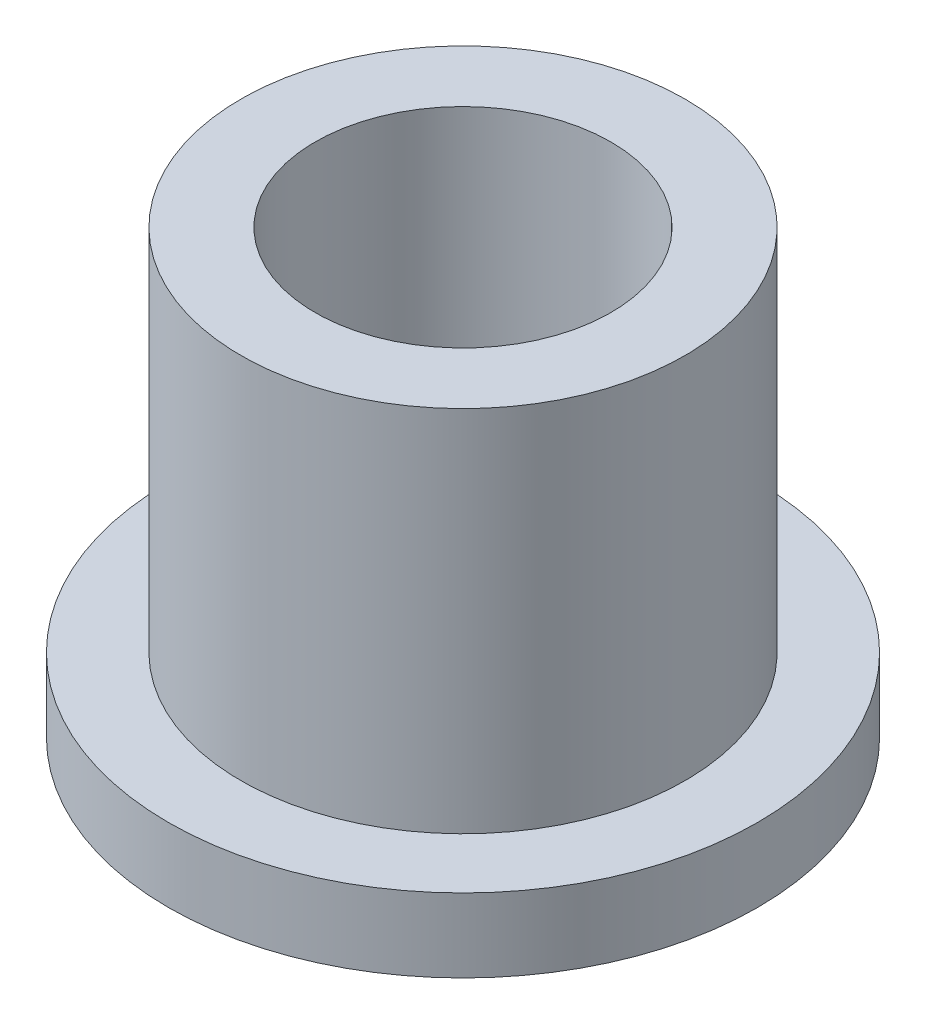
ISO-10303-21;
HEADER;
FILE_DESCRIPTION(('STEP AP214'),'2;1');
FILE_NAME('part.step','',(''),(''),'','','');
FILE_SCHEMA(('AUTOMOTIVE_DESIGN { 1 0 10303 214 1 1 1 1 }'));
ENDSEC;
DATA;
#1=APPLICATION_CONTEXT('core data for automotive mechanical design processes');
#2=APPLICATION_PROTOCOL_DEFINITION('international standard','automotive_design',2000,#1);
#3=PRODUCT_CONTEXT('',#1,'mechanical');
#4=PRODUCT('Part','Part','',(#3));
#5=PRODUCT_RELATED_PRODUCT_CATEGORY('part','',(#4));
#6=PRODUCT_DEFINITION_FORMATION('','',#4);
#7=PRODUCT_DEFINITION_CONTEXT('part definition',#1,'design');
#8=PRODUCT_DEFINITION('design','',#6,#7);
#9=PRODUCT_DEFINITION_SHAPE('','',#8);
#10=(LENGTH_UNIT() NAMED_UNIT(*) SI_UNIT(.MILLI.,.METRE.));
#11=(NAMED_UNIT(*) PLANE_ANGLE_UNIT() SI_UNIT($,.RADIAN.));
#12=(NAMED_UNIT(*) SI_UNIT($,.STERADIAN.) SOLID_ANGLE_UNIT());
#13=UNCERTAINTY_MEASURE_WITH_UNIT(LENGTH_MEASURE(1.E-05),#10,'distance_accuracy_value','');
#14=(GEOMETRIC_REPRESENTATION_CONTEXT(3) GLOBAL_UNCERTAINTY_ASSIGNED_CONTEXT((#13)) GLOBAL_UNIT_ASSIGNED_CONTEXT((#10,
#11,#12)) REPRESENTATION_CONTEXT('',''));
#15=CARTESIAN_POINT('',(0.,0.,0.));
#16=DIRECTION('',(0.,0.,1.));
#17=DIRECTION('',(1.,0.,0.));
#18=AXIS2_PLACEMENT_3D('',#15,#16,#17);
#19=CARTESIAN_POINT('',(0.,9.525,0.));
#20=DIRECTION('',(0.,1.,0.));
#21=DIRECTION('',(0.,0.,1.));
#22=AXIS2_PLACEMENT_3D('',#19,#20,#21);
#23=PLANE('',#22);
#24=CARTESIAN_POINT('',(0.,9.525,0.));
#25=DIRECTION('',(0.,1.,0.));
#26=DIRECTION('',(0.,0.,1.));
#27=AXIS2_PLACEMENT_3D('',#24,#25,#26);
#28=CIRCLE('',#27,4.7879);
#29=CARTESIAN_POINT('',(0.,9.525,-4.7879));
#30=VERTEX_POINT('',#29);
#31=EDGE_CURVE('E10',#30,#30,#28,.T.);
#32=ORIENTED_EDGE('',*,*,#31,.T.);
#33=EDGE_LOOP('',(#32));
#34=FACE_BOUND('',#33,.T.);
#35=CARTESIAN_POINT('',(0.,9.525,0.));
#36=DIRECTION('',(0.,1.,0.));
#37=DIRECTION('',(0.,0.,1.));
#38=AXIS2_PLACEMENT_3D('',#35,#36,#37);
#39=CIRCLE('',#38,3.1877);
#40=CARTESIAN_POINT('',(0.,9.525,-3.1877));
#41=VERTEX_POINT('',#40);
#42=EDGE_CURVE('E37',#41,#41,#39,.T.);
#43=ORIENTED_EDGE('',*,*,#42,.F.);
#44=EDGE_LOOP('',(#43));
#45=FACE_BOUND('',#44,.T.);
#46=ADVANCED_FACE('F30',(#34,#45),#23,.T.);
#47=CARTESIAN_POINT('',(0.,0.,0.));
#48=DIRECTION('',(0.,1.,0.));
#49=DIRECTION('',(0.,0.,1.));
#50=AXIS2_PLACEMENT_3D('',#47,#48,#49);
#51=PLANE('',#50);
#52=CARTESIAN_POINT('',(0.,0.,0.));
#53=DIRECTION('',(0.,1.,0.));
#54=DIRECTION('',(0.,0.,1.));
#55=AXIS2_PLACEMENT_3D('',#52,#53,#54);
#56=CIRCLE('',#55,3.1877);
#57=CARTESIAN_POINT('',(0.,0.,-3.1877));
#58=VERTEX_POINT('',#57);
#59=EDGE_CURVE('E41',#58,#58,#56,.T.);
#60=ORIENTED_EDGE('',*,*,#59,.T.);
#61=EDGE_LOOP('',(#60));
#62=FACE_BOUND('',#61,.T.);
#63=CARTESIAN_POINT('',(0.,0.,0.));
#64=DIRECTION('',(0.,1.,0.));
#65=DIRECTION('',(0.,0.,1.));
#66=AXIS2_PLACEMENT_3D('',#63,#64,#65);
#67=CIRCLE('',#66,6.35);
#68=CARTESIAN_POINT('',(0.,0.,6.35));
#69=VERTEX_POINT('',#68);
#70=EDGE_CURVE('E48',#69,#69,#67,.T.);
#71=ORIENTED_EDGE('',*,*,#70,.F.);
#72=EDGE_LOOP('',(#71));
#73=FACE_BOUND('',#72,.T.);
#74=ADVANCED_FACE('F73',(#62,#73),#51,.F.);
#75=CARTESIAN_POINT('',(0.,9.525,0.));
#76=DIRECTION('',(0.,-1.,0.));
#77=DIRECTION('',(0.,0.,-1.));
#78=AXIS2_PLACEMENT_3D('',#75,#76,#77);
#79=CYLINDRICAL_SURFACE('',#78,4.7879);
#80=CARTESIAN_POINT('',(0.,1.5875,0.));
#81=DIRECTION('',(0.,1.,0.));
#82=DIRECTION('',(0.,0.,1.));
#83=AXIS2_PLACEMENT_3D('',#80,#81,#82);
#84=CIRCLE('',#83,4.7879);
#85=CARTESIAN_POINT('',(0.,1.5875,-4.7879));
#86=VERTEX_POINT('',#85);
#87=EDGE_CURVE('E51',#86,#86,#84,.T.);
#88=CARTESIAN_POINT('',(0.,1.5875,-4.7879));
#89=CARTESIAN_POINT('',(0.,1.67018229166667,-4.7879));
#90=CARTESIAN_POINT('',(0.,1.75286458333333,-4.7879));
#91=CARTESIAN_POINT('',(0.,1.91822916666666,-4.7879));
#92=CARTESIAN_POINT('',(0.,2.00091145833333,-4.7879));
#93=CARTESIAN_POINT('',(0.,2.16627604166666,-4.7879));
#94=CARTESIAN_POINT('',(0.,2.24895833333333,-4.7879));
#95=CARTESIAN_POINT('',(0.,2.41432291666667,-4.7879));
#96=CARTESIAN_POINT('',(0.,2.49700520833333,-4.7879));
#97=CARTESIAN_POINT('',(0.,2.66236979166666,-4.7879));
#98=CARTESIAN_POINT('',(0.,2.74505208333333,-4.7879));
#99=CARTESIAN_POINT('',(0.,2.91041666666667,-4.7879));
#100=CARTESIAN_POINT('',(0.,2.99309895833333,-4.7879));
#101=CARTESIAN_POINT('',(0.,3.15846354166667,-4.7879));
#102=CARTESIAN_POINT('',(0.,3.24114583333333,-4.7879));
#103=CARTESIAN_POINT('',(0.,3.40651041666667,-4.7879));
#104=CARTESIAN_POINT('',(0.,3.48919270833333,-4.7879));
#105=CARTESIAN_POINT('',(0.,3.65455729166667,-4.7879));
#106=CARTESIAN_POINT('',(0.,3.73723958333333,-4.7879));
#107=CARTESIAN_POINT('',(0.,3.90260416666667,-4.7879));
#108=CARTESIAN_POINT('',(0.,3.98528645833333,-4.7879));
#109=CARTESIAN_POINT('',(0.,4.15065104166667,-4.7879));
#110=CARTESIAN_POINT('',(0.,4.23333333333333,-4.7879));
#111=CARTESIAN_POINT('',(0.,4.39869791666667,-4.7879));
#112=CARTESIAN_POINT('',(0.,4.48138020833333,-4.7879));
#113=CARTESIAN_POINT('',(0.,4.64674479166667,-4.7879));
#114=CARTESIAN_POINT('',(0.,4.72942708333333,-4.7879));
#115=CARTESIAN_POINT('',(0.,4.89479166666667,-4.7879));
#116=CARTESIAN_POINT('',(0.,4.97747395833333,-4.7879));
#117=CARTESIAN_POINT('',(0.,5.14283854166667,-4.7879));
#118=CARTESIAN_POINT('',(0.,5.22552083333333,-4.7879));
#119=CARTESIAN_POINT('',(0.,5.39088541666667,-4.7879));
#120=CARTESIAN_POINT('',(0.,5.47356770833333,-4.7879));
#121=CARTESIAN_POINT('',(0.,5.63893229166667,-4.7879));
#122=CARTESIAN_POINT('',(0.,5.72161458333333,-4.7879));
#123=CARTESIAN_POINT('',(0.,5.88697916666667,-4.7879));
#124=CARTESIAN_POINT('',(0.,5.96966145833333,-4.7879));
#125=CARTESIAN_POINT('',(0.,6.13502604166667,-4.7879));
#126=CARTESIAN_POINT('',(0.,6.21770833333333,-4.7879));
#127=CARTESIAN_POINT('',(0.,6.38307291666667,-4.7879));
#128=CARTESIAN_POINT('',(0.,6.46575520833333,-4.7879));
#129=CARTESIAN_POINT('',(0.,6.63111979166667,-4.7879));
#130=CARTESIAN_POINT('',(0.,6.71380208333333,-4.7879));
#131=CARTESIAN_POINT('',(0.,6.87916666666667,-4.7879));
#132=CARTESIAN_POINT('',(0.,6.96184895833333,-4.7879));
#133=CARTESIAN_POINT('',(0.,7.12721354166667,-4.7879));
#134=CARTESIAN_POINT('',(0.,7.20989583333333,-4.7879));
#135=CARTESIAN_POINT('',(0.,7.37526041666667,-4.7879));
#136=CARTESIAN_POINT('',(0.,7.45794270833333,-4.7879));
#137=CARTESIAN_POINT('',(0.,7.62330729166667,-4.7879));
#138=CARTESIAN_POINT('',(0.,7.70598958333333,-4.7879));
#139=CARTESIAN_POINT('',(0.,7.87135416666667,-4.7879));
#140=CARTESIAN_POINT('',(0.,7.95403645833333,-4.7879));
#141=CARTESIAN_POINT('',(0.,8.11940104166667,-4.7879));
#142=CARTESIAN_POINT('',(0.,8.20208333333333,-4.7879));
#143=CARTESIAN_POINT('',(0.,8.36744791666667,-4.7879));
#144=CARTESIAN_POINT('',(0.,8.45013020833333,-4.7879));
#145=CARTESIAN_POINT('',(0.,8.61549479166667,-4.7879));
#146=CARTESIAN_POINT('',(0.,8.69817708333333,-4.7879));
#147=CARTESIAN_POINT('',(0.,8.86354166666667,-4.7879));
#148=CARTESIAN_POINT('',(0.,8.94622395833333,-4.7879));
#149=CARTESIAN_POINT('',(0.,9.11158854166667,-4.7879));
#150=CARTESIAN_POINT('',(0.,9.19427083333333,-4.7879));
#151=CARTESIAN_POINT('',(0.,9.35963541666667,-4.7879));
#152=CARTESIAN_POINT('',(0.,9.44231770833333,-4.7879));
#153=CARTESIAN_POINT('',(0.,9.525,-4.7879));
#154=B_SPLINE_CURVE_WITH_KNOTS('',3,(#88,#89,#90,#91,#92,#93,#94,#95,#96,#97,#98,#99,#100,#101,
#102,#103,#104,#105,#106,#107,#108,#109,#110,#111,#112,#113,#114,#115,#116,#117,#118,#119,#120,
#121,#122,#123,#124,#125,#126,#127,#128,#129,#130,#131,#132,#133,#134,#135,#136,#137,#138,#139,
#140,#141,#142,#143,#144,#145,#146,#147,#148,#149,#150,#151,#152,#153),.UNSPECIFIED.,.F.,.F.,(4,
2,2,2,2,2,2,2,2,2,2,2,2,2,2,2,2,2,2,2,2,2,2,2,2,2,2,2,2,2,2,2,4),(0.,0.248046875,
0.496093749999999,0.744140625,0.992187499999999,1.240234375,1.48828125,1.736328125,1.984375,
2.232421875,2.48046875,2.728515625,2.9765625,3.224609375,3.47265625,3.720703125,3.96875,
4.216796875,4.46484375,4.712890625,4.9609375,5.208984375,5.45703125,5.705078125,5.953125,
6.201171875,6.44921875,6.697265625,6.9453125,7.193359375,7.44140625,7.689453125,7.9375),.UNSPECIFIED.);
#155=EDGE_CURVE('BSEAM32',#86,#30,#154,.T.);
#156=ORIENTED_EDGE('',*,*,#87,.T.);
#157=ORIENTED_EDGE('',*,*,#31,.F.);
#158=ORIENTED_EDGE('',*,*,#155,.T.);
#159=ORIENTED_EDGE('',*,*,#155,.F.);
#160=EDGE_LOOP('',(#156,#158,#157,#159));
#161=FACE_BOUND('',#160,.T.);
#162=ADVANCED_FACE('F32',(#161),#79,.T.);
#163=CARTESIAN_POINT('',(0.,9.525,0.));
#164=DIRECTION('',(0.,-1.,0.));
#165=DIRECTION('',(0.,0.,-1.));
#166=AXIS2_PLACEMENT_3D('',#163,#164,#165);
#167=CYLINDRICAL_SURFACE('',#166,3.1877);
#168=CARTESIAN_POINT('',(0.,9.525,-3.1877));
#169=CARTESIAN_POINT('',(0.,9.42578125,-3.1877));
#170=CARTESIAN_POINT('',(0.,9.3265625,-3.1877));
#171=CARTESIAN_POINT('',(0.,9.128125,-3.1877));
#172=CARTESIAN_POINT('',(0.,9.02890625,-3.1877));
#173=CARTESIAN_POINT('',(0.,8.83046875,-3.1877));
#174=CARTESIAN_POINT('',(0.,8.73125,-3.1877));
#175=CARTESIAN_POINT('',(0.,8.5328125,-3.1877));
#176=CARTESIAN_POINT('',(0.,8.43359375,-3.1877));
#177=CARTESIAN_POINT('',(0.,8.23515625,-3.1877));
#178=CARTESIAN_POINT('',(0.,8.1359375,-3.1877));
#179=CARTESIAN_POINT('',(0.,7.9375,-3.1877));
#180=CARTESIAN_POINT('',(0.,7.83828125,-3.1877));
#181=CARTESIAN_POINT('',(0.,7.63984375,-3.1877));
#182=CARTESIAN_POINT('',(0.,7.540625,-3.1877));
#183=CARTESIAN_POINT('',(0.,7.3421875,-3.1877));
#184=CARTESIAN_POINT('',(0.,7.24296875,-3.1877));
#185=CARTESIAN_POINT('',(0.,7.04453125,-3.1877));
#186=CARTESIAN_POINT('',(0.,6.9453125,-3.1877));
#187=CARTESIAN_POINT('',(0.,6.746875,-3.1877));
#188=CARTESIAN_POINT('',(0.,6.64765625,-3.1877));
#189=CARTESIAN_POINT('',(0.,6.44921875,-3.1877));
#190=CARTESIAN_POINT('',(0.,6.35,-3.1877));
#191=CARTESIAN_POINT('',(0.,6.1515625,-3.1877));
#192=CARTESIAN_POINT('',(0.,6.05234375,-3.1877));
#193=CARTESIAN_POINT('',(0.,5.85390625,-3.1877));
#194=CARTESIAN_POINT('',(0.,5.7546875,-3.1877));
#195=CARTESIAN_POINT('',(0.,5.55625,-3.1877));
#196=CARTESIAN_POINT('',(0.,5.45703125,-3.1877));
#197=CARTESIAN_POINT('',(0.,5.25859375,-3.1877));
#198=CARTESIAN_POINT('',(0.,5.159375,-3.1877));
#199=CARTESIAN_POINT('',(0.,4.9609375,-3.1877));
#200=CARTESIAN_POINT('',(0.,4.86171875,-3.1877));
#201=CARTESIAN_POINT('',(0.,4.66328125,-3.1877));
#202=CARTESIAN_POINT('',(0.,4.5640625,-3.1877));
#203=CARTESIAN_POINT('',(0.,4.365625,-3.1877));
#204=CARTESIAN_POINT('',(0.,4.26640625,-3.1877));
#205=CARTESIAN_POINT('',(0.,4.06796875,-3.1877));
#206=CARTESIAN_POINT('',(0.,3.96875,-3.1877));
#207=CARTESIAN_POINT('',(0.,3.7703125,-3.1877));
#208=CARTESIAN_POINT('',(0.,3.67109375,-3.1877));
#209=CARTESIAN_POINT('',(0.,3.47265625,-3.1877));
#210=CARTESIAN_POINT('',(0.,3.3734375,-3.1877));
#211=CARTESIAN_POINT('',(0.,3.175,-3.1877));
#212=CARTESIAN_POINT('',(0.,3.07578125,-3.1877));
#213=CARTESIAN_POINT('',(0.,2.87734375,-3.1877));
#214=CARTESIAN_POINT('',(0.,2.778125,-3.1877));
#215=CARTESIAN_POINT('',(0.,2.5796875,-3.1877));
#216=CARTESIAN_POINT('',(0.,2.48046875,-3.1877));
#217=CARTESIAN_POINT('',(0.,2.28203125,-3.1877));
#218=CARTESIAN_POINT('',(0.,2.1828125,-3.1877));
#219=CARTESIAN_POINT('',(0.,1.984375,-3.1877));
#220=CARTESIAN_POINT('',(0.,1.88515625,-3.1877));
#221=CARTESIAN_POINT('',(0.,1.68671875,-3.1877));
#222=CARTESIAN_POINT('',(0.,1.5875,-3.1877));
#223=CARTESIAN_POINT('',(0.,1.3890625,-3.1877));
#224=CARTESIAN_POINT('',(0.,1.28984375,-3.1877));
#225=CARTESIAN_POINT('',(0.,1.09140625,-3.1877));
#226=CARTESIAN_POINT('',(0.,0.992187500000001,-3.1877));
#227=CARTESIAN_POINT('',(0.,0.793750000000001,-3.1877));
#228=CARTESIAN_POINT('',(0.,0.69453125,-3.1877));
#229=CARTESIAN_POINT('',(0.,0.49609375,-3.1877));
#230=CARTESIAN_POINT('',(0.,0.396875,-3.1877));
#231=CARTESIAN_POINT('',(0.,0.1984375,-3.1877));
#232=CARTESIAN_POINT('',(0.,0.0992187500000001,-3.1877));
#233=CARTESIAN_POINT('',(0.,0.,-3.1877));
#234=B_SPLINE_CURVE_WITH_KNOTS('',3,(#168,#169,#170,#171,#172,#173,#174,#175,#176,#177,#178,
#179,#180,#181,#182,#183,#184,#185,#186,#187,#188,#189,#190,#191,#192,#193,#194,#195,#196,#197,
#198,#199,#200,#201,#202,#203,#204,#205,#206,#207,#208,#209,#210,#211,#212,#213,#214,#215,#216,
#217,#218,#219,#220,#221,#222,#223,#224,#225,#226,#227,#228,#229,#230,#231,#232,#233),
.UNSPECIFIED.,.F.,.F.,(4,2,2,2,2,2,2,2,2,2,2,2,2,2,2,2,2,2,2,2,2,2,2,2,2,2,2,2,2,2,2,2,4),(0.,
0.297656249999998,0.595312499999999,0.892968749999999,1.190625,1.48828125,1.7859375,2.08359375,
2.38125,2.67890625,2.9765625,3.27421875,3.571875,3.86953125,4.1671875,4.46484375,4.7625,
5.06015625,5.3578125,5.65546875,5.953125,6.25078125,6.5484375,6.84609375,7.14375,7.44140625,
7.7390625,8.03671875,8.334375,8.63203125,8.9296875,9.22734375,9.525),.UNSPECIFIED.);
#235=EDGE_CURVE('BSEAM62',#41,#58,#234,.T.);
#236=ORIENTED_EDGE('',*,*,#42,.T.);
#237=ORIENTED_EDGE('',*,*,#59,.F.);
#238=ORIENTED_EDGE('',*,*,#235,.T.);
#239=ORIENTED_EDGE('',*,*,#235,.F.);
#240=EDGE_LOOP('',(#236,#238,#237,#239));
#241=FACE_BOUND('',#240,.T.);
#242=ADVANCED_FACE('F62',(#241),#167,.F.);
#243=CARTESIAN_POINT('',(0.,1.5875,0.));
#244=DIRECTION('',(0.,1.,0.));
#245=DIRECTION('',(0.,0.,1.));
#246=AXIS2_PLACEMENT_3D('',#243,#244,#245);
#247=PLANE('',#246);
#248=CARTESIAN_POINT('',(0.,1.5875,0.));
#249=DIRECTION('',(0.,1.,0.));
#250=DIRECTION('',(0.,0.,1.));
#251=AXIS2_PLACEMENT_3D('',#248,#249,#250);
#252=CIRCLE('',#251,6.35);
#253=CARTESIAN_POINT('',(0.,1.5875,6.35));
#254=VERTEX_POINT('',#253);
#255=EDGE_CURVE('E46',#254,#254,#252,.T.);
#256=ORIENTED_EDGE('',*,*,#255,.T.);
#257=EDGE_LOOP('',(#256));
#258=FACE_BOUND('',#257,.T.);
#259=ORIENTED_EDGE('',*,*,#87,.F.);
#260=EDGE_LOOP('',(#259));
#261=FACE_BOUND('',#260,.T.);
#262=ADVANCED_FACE('F59',(#258,#261),#247,.T.);
#263=CARTESIAN_POINT('',(0.,1.5875,0.));
#264=DIRECTION('',(0.,-1.,0.));
#265=DIRECTION('',(0.,0.,-1.));
#266=AXIS2_PLACEMENT_3D('',#263,#264,#265);
#267=CYLINDRICAL_SURFACE('',#266,6.35);
#268=ORIENTED_EDGE('',*,*,#255,.F.);
#269=EDGE_LOOP('',(#268));
#270=FACE_BOUND('',#269,.T.);
#271=ORIENTED_EDGE('',*,*,#70,.T.);
#272=EDGE_LOOP('',(#271));
#273=FACE_BOUND('',#272,.T.);
#274=ADVANCED_FACE('F61',(#270,#273),#267,.T.);
#275=CLOSED_SHELL('',(#46,#74,#162,#242,#262,#274));
#276=MANIFOLD_SOLID_BREP('B2',#275);
#277=ADVANCED_BREP_SHAPE_REPRESENTATION('',(#18,#276),#14);
#278=SHAPE_DEFINITION_REPRESENTATION(#9,#277);
ENDSEC;
END-ISO-10303-21;
